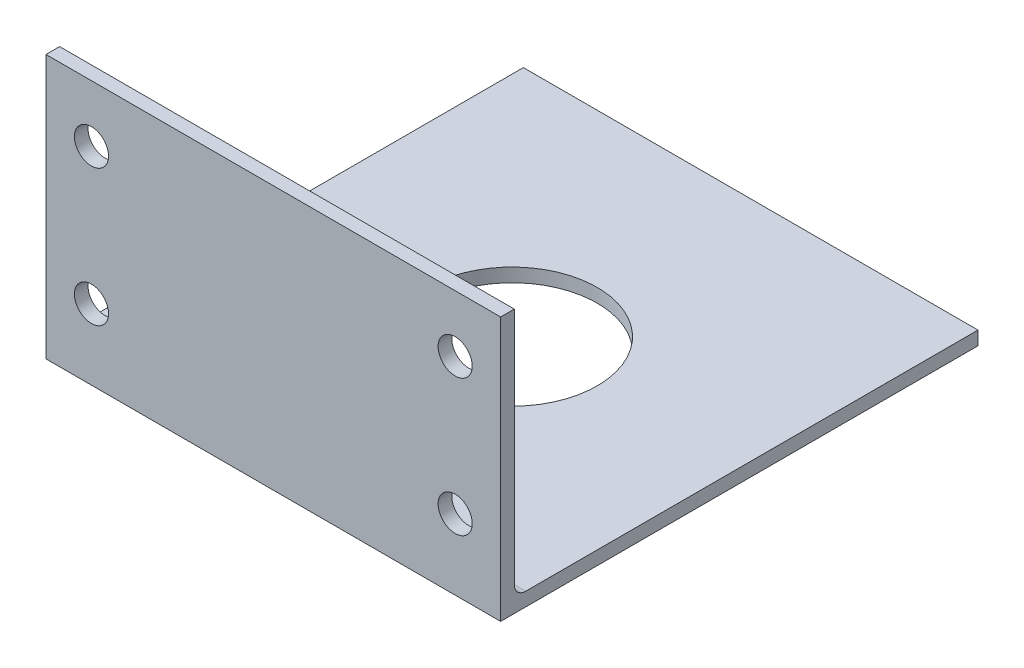
ISO-10303-21;
HEADER;
FILE_DESCRIPTION(('STEP AP214'),'2;1');
FILE_NAME('part.step','',(''),(''),'','','');
FILE_SCHEMA(('AUTOMOTIVE_DESIGN { 1 0 10303 214 1 1 1 1 }'));
ENDSEC;
DATA;
#1=APPLICATION_CONTEXT('core data for automotive mechanical design processes');
#2=APPLICATION_PROTOCOL_DEFINITION('international standard','automotive_design',2000,#1);
#3=PRODUCT_CONTEXT('',#1,'mechanical');
#4=PRODUCT('Part','Part','',(#3));
#5=PRODUCT_RELATED_PRODUCT_CATEGORY('part','',(#4));
#6=PRODUCT_DEFINITION_FORMATION('','',#4);
#7=PRODUCT_DEFINITION_CONTEXT('part definition',#1,'design');
#8=PRODUCT_DEFINITION('design','',#6,#7);
#9=PRODUCT_DEFINITION_SHAPE('','',#8);
#10=(LENGTH_UNIT() NAMED_UNIT(*) SI_UNIT(.MILLI.,.METRE.));
#11=(NAMED_UNIT(*) PLANE_ANGLE_UNIT() SI_UNIT($,.RADIAN.));
#12=(NAMED_UNIT(*) SI_UNIT($,.STERADIAN.) SOLID_ANGLE_UNIT());
#13=UNCERTAINTY_MEASURE_WITH_UNIT(LENGTH_MEASURE(1.E-05),#10,'distance_accuracy_value','');
#14=(GEOMETRIC_REPRESENTATION_CONTEXT(3) GLOBAL_UNCERTAINTY_ASSIGNED_CONTEXT((#13)) GLOBAL_UNIT_ASSIGNED_CONTEXT((#10,
#11,#12)) REPRESENTATION_CONTEXT('',''));
#15=CARTESIAN_POINT('',(0.,0.,0.));
#16=DIRECTION('',(0.,0.,1.));
#17=DIRECTION('',(1.,0.,0.));
#18=AXIS2_PLACEMENT_3D('',#15,#16,#17);
#19=CARTESIAN_POINT('',(0.,0.6,0.));
#20=DIRECTION('',(0.,-1.,0.));
#21=DIRECTION('',(0.,0.,-1.));
#22=AXIS2_PLACEMENT_3D('',#19,#20,#21);
#23=PLANE('',#22);
#24=CARTESIAN_POINT('',(20.,0.6,-21.));
#25=DIRECTION('',(0.,1.,0.));
#26=DIRECTION('',(0.,0.,1.));
#27=AXIS2_PLACEMENT_3D('',#24,#25,#26);
#28=CIRCLE('',#27,7.5);
#29=CARTESIAN_POINT('',(20.,0.6,-13.5));
#30=VERTEX_POINT('',#29);
#31=EDGE_CURVE('E129',#30,#30,#28,.T.);
#32=ORIENTED_EDGE('',*,*,#31,.F.);
#33=EDGE_LOOP('',(#32));
#34=FACE_BOUND('',#33,.T.);
#35=DIRECTION('',(0.,0.,1.));
#36=VECTOR('',#35,1.);
#37=CARTESIAN_POINT('',(0.,0.6,0.));
#38=LINE('',#37,#36);
#39=CARTESIAN_POINT('',(0.,0.6,-42.));
#40=VERTEX_POINT('',#39);
#41=CARTESIAN_POINT('',(0.,0.6,-2.2));
#42=VERTEX_POINT('',#41);
#43=EDGE_CURVE('E135',#40,#42,#38,.T.);
#44=ORIENTED_EDGE('',*,*,#43,.T.);
#45=DIRECTION('',(-1.,0.,0.));
#46=VECTOR('',#45,1.);
#47=CARTESIAN_POINT('',(40.,0.6,-2.2));
#48=LINE('',#47,#46);
#49=CARTESIAN_POINT('',(40.,0.6,-2.2));
#50=VERTEX_POINT('',#49);
#51=EDGE_CURVE('E54',#42,#50,#48,.F.);
#52=ORIENTED_EDGE('',*,*,#51,.T.);
#53=DIRECTION('',(0.,0.,-1.));
#54=VECTOR('',#53,1.);
#55=CARTESIAN_POINT('',(40.,0.6,0.));
#56=LINE('',#55,#54);
#57=CARTESIAN_POINT('',(40.,0.6,-42.));
#58=VERTEX_POINT('',#57);
#59=EDGE_CURVE('E137',#50,#58,#56,.T.);
#60=ORIENTED_EDGE('',*,*,#59,.T.);
#61=DIRECTION('',(-1.,0.,0.));
#62=VECTOR('',#61,1.);
#63=CARTESIAN_POINT('',(0.,0.6,-42.));
#64=LINE('',#63,#62);
#65=EDGE_CURVE('E140',#58,#40,#64,.T.);
#66=ORIENTED_EDGE('',*,*,#65,.T.);
#67=EDGE_LOOP('',(#44,#52,#60,#66));
#68=FACE_BOUND('',#67,.T.);
#69=ADVANCED_FACE('F33',(#34,#68),#23,.F.);
#70=CARTESIAN_POINT('',(0.,0.6,0.));
#71=DIRECTION('',(1.,0.,0.));
#72=DIRECTION('',(0.,0.,-1.));
#73=AXIS2_PLACEMENT_3D('',#70,#71,#72);
#74=PLANE('',#73);
#75=DIRECTION('',(0.,0.,1.));
#76=VECTOR('',#75,1.);
#77=CARTESIAN_POINT('',(0.,-0.6,0.));
#78=LINE('',#77,#76);
#79=CARTESIAN_POINT('',(0.,-0.6,-42.));
#80=VERTEX_POINT('',#79);
#81=CARTESIAN_POINT('',(0.,-0.6,0.));
#82=VERTEX_POINT('',#81);
#83=EDGE_CURVE('E98',#80,#82,#78,.T.);
#84=ORIENTED_EDGE('',*,*,#83,.T.);
#85=DIRECTION('',(0.,-1.,0.));
#86=VECTOR('',#85,1.);
#87=CARTESIAN_POINT('',(0.,0.6,0.));
#88=LINE('',#87,#86);
#89=CARTESIAN_POINT('',(0.,22.6,0.));
#90=VERTEX_POINT('',#89);
#91=EDGE_CURVE('E91',#90,#82,#88,.T.);
#92=ORIENTED_EDGE('',*,*,#91,.F.);
#93=DIRECTION('',(0.,0.,1.));
#94=VECTOR('',#93,1.);
#95=CARTESIAN_POINT('',(0.,22.6,0.));
#96=LINE('',#95,#94);
#97=CARTESIAN_POINT('',(0.,22.6,-1.2));
#98=VERTEX_POINT('',#97);
#99=EDGE_CURVE('E95',#98,#90,#96,.T.);
#100=ORIENTED_EDGE('',*,*,#99,.F.);
#101=DIRECTION('',(0.,-1.,0.));
#102=VECTOR('',#101,1.);
#103=CARTESIAN_POINT('',(0.,22.6,-1.2));
#104=LINE('',#103,#102);
#105=CARTESIAN_POINT('',(0.,1.6,-1.2));
#106=VERTEX_POINT('',#105);
#107=EDGE_CURVE('E124',#98,#106,#104,.T.);
#108=ORIENTED_EDGE('',*,*,#107,.T.);
#109=CARTESIAN_POINT('',(0.,1.6,-2.2));
#110=DIRECTION('',(1.,0.,0.));
#111=DIRECTION('',(0.,0.,-1.));
#112=AXIS2_PLACEMENT_3D('',#109,#110,#111);
#113=CIRCLE('',#112,1.);
#114=EDGE_CURVE('E41',#106,#42,#113,.T.);
#115=ORIENTED_EDGE('',*,*,#114,.T.);
#116=ORIENTED_EDGE('',*,*,#43,.F.);
#117=DIRECTION('',(0.,-1.,0.));
#118=VECTOR('',#117,1.);
#119=CARTESIAN_POINT('',(0.,0.6,-42.));
#120=LINE('',#119,#118);
#121=EDGE_CURVE('E142',#40,#80,#120,.T.);
#122=ORIENTED_EDGE('',*,*,#121,.T.);
#123=EDGE_LOOP('',(#84,#92,#100,#108,#115,#116,#122));
#124=FACE_BOUND('',#123,.T.);
#125=ADVANCED_FACE('F93',(#124),#74,.F.);
#126=CARTESIAN_POINT('',(0.,0.6,0.));
#127=DIRECTION('',(0.,0.,-1.));
#128=DIRECTION('',(-1.,0.,0.));
#129=AXIS2_PLACEMENT_3D('',#126,#127,#128);
#130=PLANE('',#129);
#131=CARTESIAN_POINT('',(36.,5.6,0.));
#132=DIRECTION('',(0.,0.,-1.));
#133=DIRECTION('',(-1.,0.,0.));
#134=AXIS2_PLACEMENT_3D('',#131,#132,#133);
#135=CIRCLE('',#134,1.5);
#136=CARTESIAN_POINT('',(34.5,5.6,0.));
#137=VERTEX_POINT('',#136);
#138=EDGE_CURVE('E226',#137,#137,#135,.T.);
#139=ORIENTED_EDGE('',*,*,#138,.T.);
#140=EDGE_LOOP('',(#139));
#141=FACE_BOUND('',#140,.T.);
#142=CARTESIAN_POINT('',(4.,17.6,0.));
#143=DIRECTION('',(0.,0.,-1.));
#144=DIRECTION('',(-1.,0.,0.));
#145=AXIS2_PLACEMENT_3D('',#142,#143,#144);
#146=CIRCLE('',#145,1.5);
#147=CARTESIAN_POINT('',(2.5,17.6,0.));
#148=VERTEX_POINT('',#147);
#149=EDGE_CURVE('E232',#148,#148,#146,.T.);
#150=ORIENTED_EDGE('',*,*,#149,.T.);
#151=EDGE_LOOP('',(#150));
#152=FACE_BOUND('',#151,.T.);
#153=CARTESIAN_POINT('',(4.,5.6,0.));
#154=DIRECTION('',(0.,0.,-1.));
#155=DIRECTION('',(-1.,0.,0.));
#156=AXIS2_PLACEMENT_3D('',#153,#154,#155);
#157=CIRCLE('',#156,1.5);
#158=CARTESIAN_POINT('',(2.5,5.6,0.));
#159=VERTEX_POINT('',#158);
#160=EDGE_CURVE('E217',#159,#159,#157,.T.);
#161=ORIENTED_EDGE('',*,*,#160,.T.);
#162=EDGE_LOOP('',(#161));
#163=FACE_BOUND('',#162,.T.);
#164=CARTESIAN_POINT('',(36.,17.6,0.));
#165=DIRECTION('',(0.,0.,-1.));
#166=DIRECTION('',(-1.,0.,0.));
#167=AXIS2_PLACEMENT_3D('',#164,#165,#166);
#168=CIRCLE('',#167,1.5);
#169=CARTESIAN_POINT('',(34.5,17.6,0.));
#170=VERTEX_POINT('',#169);
#171=EDGE_CURVE('E115',#170,#170,#168,.T.);
#172=ORIENTED_EDGE('',*,*,#171,.T.);
#173=EDGE_LOOP('',(#172));
#174=FACE_BOUND('',#173,.T.);
#175=DIRECTION('',(1.,0.,0.));
#176=VECTOR('',#175,1.);
#177=CARTESIAN_POINT('',(0.,-0.6,0.));
#178=LINE('',#177,#176);
#179=CARTESIAN_POINT('',(40.,-0.6,0.));
#180=VERTEX_POINT('',#179);
#181=EDGE_CURVE('E144',#82,#180,#178,.T.);
#182=ORIENTED_EDGE('',*,*,#181,.T.);
#183=DIRECTION('',(0.,-1.,0.));
#184=VECTOR('',#183,1.);
#185=CARTESIAN_POINT('',(40.,0.6,0.));
#186=LINE('',#185,#184);
#187=CARTESIAN_POINT('',(40.,22.6,0.));
#188=VERTEX_POINT('',#187);
#189=EDGE_CURVE('E101',#188,#180,#186,.T.);
#190=ORIENTED_EDGE('',*,*,#189,.F.);
#191=DIRECTION('',(1.,0.,0.));
#192=VECTOR('',#191,1.);
#193=CARTESIAN_POINT('',(0.,22.6,0.));
#194=LINE('',#193,#192);
#195=EDGE_CURVE('E104',#90,#188,#194,.T.);
#196=ORIENTED_EDGE('',*,*,#195,.F.);
#197=ORIENTED_EDGE('',*,*,#91,.T.);
#198=EDGE_LOOP('',(#182,#190,#196,#197));
#199=FACE_BOUND('',#198,.T.);
#200=ADVANCED_FACE('F105',(#141,#152,#163,#174,#199),#130,.F.);
#201=CARTESIAN_POINT('',(40.,0.6,0.));
#202=DIRECTION('',(-1.,0.,0.));
#203=DIRECTION('',(0.,0.,1.));
#204=AXIS2_PLACEMENT_3D('',#201,#202,#203);
#205=PLANE('',#204);
#206=DIRECTION('',(0.,0.,-1.));
#207=VECTOR('',#206,1.);
#208=CARTESIAN_POINT('',(40.,-0.6,0.));
#209=LINE('',#208,#207);
#210=CARTESIAN_POINT('',(40.,-0.6,-42.));
#211=VERTEX_POINT('',#210);
#212=EDGE_CURVE('E146',#180,#211,#209,.T.);
#213=ORIENTED_EDGE('',*,*,#212,.T.);
#214=DIRECTION('',(0.,-1.,0.));
#215=VECTOR('',#214,1.);
#216=CARTESIAN_POINT('',(40.,0.6,-42.));
#217=LINE('',#216,#215);
#218=EDGE_CURVE('E150',#58,#211,#217,.T.);
#219=ORIENTED_EDGE('',*,*,#218,.F.);
#220=ORIENTED_EDGE('',*,*,#59,.F.);
#221=CARTESIAN_POINT('',(40.,1.6,-2.2));
#222=DIRECTION('',(-1.,0.,0.));
#223=DIRECTION('',(0.,0.,1.));
#224=AXIS2_PLACEMENT_3D('',#221,#222,#223);
#225=CIRCLE('',#224,1.);
#226=CARTESIAN_POINT('',(40.,1.6,-1.2));
#227=VERTEX_POINT('',#226);
#228=EDGE_CURVE('E11',#50,#227,#225,.T.);
#229=ORIENTED_EDGE('',*,*,#228,.T.);
#230=DIRECTION('',(0.,-1.,0.));
#231=VECTOR('',#230,1.);
#232=CARTESIAN_POINT('',(40.,22.6,-1.2));
#233=LINE('',#232,#231);
#234=CARTESIAN_POINT('',(40.,22.6,-1.2));
#235=VERTEX_POINT('',#234);
#236=EDGE_CURVE('E126',#235,#227,#233,.T.);
#237=ORIENTED_EDGE('',*,*,#236,.F.);
#238=DIRECTION('',(0.,0.,-1.));
#239=VECTOR('',#238,1.);
#240=CARTESIAN_POINT('',(40.,22.6,0.));
#241=LINE('',#240,#239);
#242=EDGE_CURVE('E109',#188,#235,#241,.T.);
#243=ORIENTED_EDGE('',*,*,#242,.F.);
#244=ORIENTED_EDGE('',*,*,#189,.T.);
#245=EDGE_LOOP('',(#213,#219,#220,#229,#237,#243,#244));
#246=FACE_BOUND('',#245,.T.);
#247=ADVANCED_FACE('F163',(#246),#205,.F.);
#248=CARTESIAN_POINT('',(0.,0.6,-42.));
#249=DIRECTION('',(0.,0.,1.));
#250=DIRECTION('',(1.,0.,0.));
#251=AXIS2_PLACEMENT_3D('',#248,#249,#250);
#252=PLANE('',#251);
#253=DIRECTION('',(-1.,0.,0.));
#254=VECTOR('',#253,1.);
#255=CARTESIAN_POINT('',(0.,-0.6,-42.));
#256=LINE('',#255,#254);
#257=EDGE_CURVE('E138',#211,#80,#256,.T.);
#258=ORIENTED_EDGE('',*,*,#257,.T.);
#259=ORIENTED_EDGE('',*,*,#121,.F.);
#260=ORIENTED_EDGE('',*,*,#65,.F.);
#261=ORIENTED_EDGE('',*,*,#218,.T.);
#262=EDGE_LOOP('',(#258,#259,#260,#261));
#263=FACE_BOUND('',#262,.T.);
#264=ADVANCED_FACE('F168',(#263),#252,.F.);
#265=CARTESIAN_POINT('',(0.,-0.6,0.));
#266=DIRECTION('',(0.,-1.,0.));
#267=DIRECTION('',(0.,0.,-1.));
#268=AXIS2_PLACEMENT_3D('',#265,#266,#267);
#269=PLANE('',#268);
#270=CARTESIAN_POINT('',(20.,-0.6,-21.));
#271=DIRECTION('',(0.,1.,0.));
#272=DIRECTION('',(0.,0.,1.));
#273=AXIS2_PLACEMENT_3D('',#270,#271,#272);
#274=CIRCLE('',#273,7.5);
#275=CARTESIAN_POINT('',(20.,-0.6,-13.5));
#276=VERTEX_POINT('',#275);
#277=EDGE_CURVE('E130',#276,#276,#274,.T.);
#278=ORIENTED_EDGE('',*,*,#277,.T.);
#279=EDGE_LOOP('',(#278));
#280=FACE_BOUND('',#279,.T.);
#281=ORIENTED_EDGE('',*,*,#83,.F.);
#282=ORIENTED_EDGE('',*,*,#257,.F.);
#283=ORIENTED_EDGE('',*,*,#212,.F.);
#284=ORIENTED_EDGE('',*,*,#181,.F.);
#285=EDGE_LOOP('',(#281,#282,#283,#284));
#286=FACE_BOUND('',#285,.T.);
#287=ADVANCED_FACE('F171',(#280,#286),#269,.T.);
#288=CARTESIAN_POINT('',(20.,-0.6,-21.));
#289=DIRECTION('',(0.,1.,0.));
#290=DIRECTION('',(0.,0.,1.));
#291=AXIS2_PLACEMENT_3D('',#288,#289,#290);
#292=CYLINDRICAL_SURFACE('',#291,7.5);
#293=ORIENTED_EDGE('',*,*,#277,.F.);
#294=EDGE_LOOP('',(#293));
#295=FACE_BOUND('',#294,.T.);
#296=ORIENTED_EDGE('',*,*,#31,.T.);
#297=EDGE_LOOP('',(#296));
#298=FACE_BOUND('',#297,.T.);
#299=ADVANCED_FACE('F174',(#295,#298),#292,.F.);
#300=CARTESIAN_POINT('',(0.,22.6,-1.2));
#301=DIRECTION('',(0.,0.,1.));
#302=DIRECTION('',(1.,0.,0.));
#303=AXIS2_PLACEMENT_3D('',#300,#301,#302);
#304=PLANE('',#303);
#305=CARTESIAN_POINT('',(36.,5.6,-1.2));
#306=DIRECTION('',(0.,0.,-1.));
#307=DIRECTION('',(-1.,0.,0.));
#308=AXIS2_PLACEMENT_3D('',#305,#306,#307);
#309=CIRCLE('',#308,1.5);
#310=CARTESIAN_POINT('',(34.5,5.6,-1.2));
#311=VERTEX_POINT('',#310);
#312=EDGE_CURVE('E229',#311,#311,#309,.T.);
#313=ORIENTED_EDGE('',*,*,#312,.F.);
#314=EDGE_LOOP('',(#313));
#315=FACE_BOUND('',#314,.T.);
#316=CARTESIAN_POINT('',(4.,17.6,-1.2));
#317=DIRECTION('',(0.,0.,-1.));
#318=DIRECTION('',(-1.,0.,0.));
#319=AXIS2_PLACEMENT_3D('',#316,#317,#318);
#320=CIRCLE('',#319,1.5);
#321=CARTESIAN_POINT('',(2.5,17.6,-1.2));
#322=VERTEX_POINT('',#321);
#323=EDGE_CURVE('E223',#322,#322,#320,.T.);
#324=ORIENTED_EDGE('',*,*,#323,.F.);
#325=EDGE_LOOP('',(#324));
#326=FACE_BOUND('',#325,.T.);
#327=CARTESIAN_POINT('',(4.,5.6,-1.2));
#328=DIRECTION('',(0.,0.,-1.));
#329=DIRECTION('',(-1.,0.,0.));
#330=AXIS2_PLACEMENT_3D('',#327,#328,#329);
#331=CIRCLE('',#330,1.5);
#332=CARTESIAN_POINT('',(2.5,5.6,-1.2));
#333=VERTEX_POINT('',#332);
#334=EDGE_CURVE('E220',#333,#333,#331,.T.);
#335=ORIENTED_EDGE('',*,*,#334,.F.);
#336=EDGE_LOOP('',(#335));
#337=FACE_BOUND('',#336,.T.);
#338=CARTESIAN_POINT('',(36.,17.6,-1.2));
#339=DIRECTION('',(0.,0.,-1.));
#340=DIRECTION('',(-1.,0.,0.));
#341=AXIS2_PLACEMENT_3D('',#338,#339,#340);
#342=CIRCLE('',#341,1.5);
#343=CARTESIAN_POINT('',(34.5,17.6,-1.2));
#344=VERTEX_POINT('',#343);
#345=EDGE_CURVE('E118',#344,#344,#342,.T.);
#346=ORIENTED_EDGE('',*,*,#345,.F.);
#347=EDGE_LOOP('',(#346));
#348=FACE_BOUND('',#347,.T.);
#349=ORIENTED_EDGE('',*,*,#236,.T.);
#350=DIRECTION('',(-1.,0.,0.));
#351=VECTOR('',#350,1.);
#352=CARTESIAN_POINT('',(0.,1.6,-1.2));
#353=LINE('',#352,#351);
#354=EDGE_CURVE('E100',#227,#106,#353,.T.);
#355=ORIENTED_EDGE('',*,*,#354,.T.);
#356=ORIENTED_EDGE('',*,*,#107,.F.);
#357=DIRECTION('',(-1.,0.,0.));
#358=VECTOR('',#357,1.);
#359=CARTESIAN_POINT('',(0.,22.6,-1.2));
#360=LINE('',#359,#358);
#361=EDGE_CURVE('E113',#235,#98,#360,.T.);
#362=ORIENTED_EDGE('',*,*,#361,.F.);
#363=EDGE_LOOP('',(#349,#355,#356,#362));
#364=FACE_BOUND('',#363,.T.);
#365=ADVANCED_FACE('F158',(#315,#326,#337,#348,#364),#304,.F.);
#366=CARTESIAN_POINT('',(0.,22.6,0.));
#367=DIRECTION('',(0.,-1.,0.));
#368=DIRECTION('',(0.,0.,-1.));
#369=AXIS2_PLACEMENT_3D('',#366,#367,#368);
#370=PLANE('',#369);
#371=ORIENTED_EDGE('',*,*,#99,.T.);
#372=ORIENTED_EDGE('',*,*,#195,.T.);
#373=ORIENTED_EDGE('',*,*,#242,.T.);
#374=ORIENTED_EDGE('',*,*,#361,.T.);
#375=EDGE_LOOP('',(#371,#372,#373,#374));
#376=FACE_BOUND('',#375,.T.);
#377=ADVANCED_FACE('F111',(#376),#370,.F.);
#378=CARTESIAN_POINT('',(36.,17.6,0.));
#379=DIRECTION('',(0.,0.,-1.));
#380=DIRECTION('',(-1.,0.,0.));
#381=AXIS2_PLACEMENT_3D('',#378,#379,#380);
#382=CYLINDRICAL_SURFACE('',#381,1.5);
#383=ORIENTED_EDGE('',*,*,#171,.F.);
#384=EDGE_LOOP('',(#383));
#385=FACE_BOUND('',#384,.T.);
#386=ORIENTED_EDGE('',*,*,#345,.T.);
#387=EDGE_LOOP('',(#386));
#388=FACE_BOUND('',#387,.T.);
#389=ADVANCED_FACE('F197',(#385,#388),#382,.F.);
#390=CARTESIAN_POINT('',(4.,5.6,0.));
#391=DIRECTION('',(0.,0.,-1.));
#392=DIRECTION('',(-1.,0.,0.));
#393=AXIS2_PLACEMENT_3D('',#390,#391,#392);
#394=CYLINDRICAL_SURFACE('',#393,1.5);
#395=ORIENTED_EDGE('',*,*,#160,.F.);
#396=EDGE_LOOP('',(#395));
#397=FACE_BOUND('',#396,.T.);
#398=ORIENTED_EDGE('',*,*,#334,.T.);
#399=EDGE_LOOP('',(#398));
#400=FACE_BOUND('',#399,.T.);
#401=ADVANCED_FACE('F200',(#397,#400),#394,.F.);
#402=CARTESIAN_POINT('',(4.,17.6,0.));
#403=DIRECTION('',(0.,0.,-1.));
#404=DIRECTION('',(-1.,0.,0.));
#405=AXIS2_PLACEMENT_3D('',#402,#403,#404);
#406=CYLINDRICAL_SURFACE('',#405,1.5);
#407=ORIENTED_EDGE('',*,*,#149,.F.);
#408=EDGE_LOOP('',(#407));
#409=FACE_BOUND('',#408,.T.);
#410=ORIENTED_EDGE('',*,*,#323,.T.);
#411=EDGE_LOOP('',(#410));
#412=FACE_BOUND('',#411,.T.);
#413=ADVANCED_FACE('F202',(#409,#412),#406,.F.);
#414=CARTESIAN_POINT('',(36.,5.6,0.));
#415=DIRECTION('',(0.,0.,-1.));
#416=DIRECTION('',(-1.,0.,0.));
#417=AXIS2_PLACEMENT_3D('',#414,#415,#416);
#418=CYLINDRICAL_SURFACE('',#417,1.5);
#419=ORIENTED_EDGE('',*,*,#138,.F.);
#420=EDGE_LOOP('',(#419));
#421=FACE_BOUND('',#420,.T.);
#422=ORIENTED_EDGE('',*,*,#312,.T.);
#423=EDGE_LOOP('',(#422));
#424=FACE_BOUND('',#423,.T.);
#425=ADVANCED_FACE('F205',(#421,#424),#418,.F.);
#426=CARTESIAN_POINT('',(0.,1.6,-2.2));
#427=DIRECTION('',(1.,0.,0.));
#428=DIRECTION('',(0.,0.,-1.));
#429=AXIS2_PLACEMENT_3D('',#426,#427,#428);
#430=CYLINDRICAL_SURFACE('',#429,1.);
#431=ORIENTED_EDGE('',*,*,#228,.F.);
#432=ORIENTED_EDGE('',*,*,#51,.F.);
#433=ORIENTED_EDGE('',*,*,#114,.F.);
#434=ORIENTED_EDGE('',*,*,#354,.F.);
#435=EDGE_LOOP('',(#431,#432,#433,#434));
#436=FACE_BOUND('',#435,.T.);
#437=ADVANCED_FACE('F35',(#436),#430,.F.);
#438=CLOSED_SHELL('',(#69,#125,#200,#247,#264,#287,#299,#365,#377,#389,#401,#413,#425,#437));
#439=MANIFOLD_SOLID_BREP('B2',#438);
#440=ADVANCED_BREP_SHAPE_REPRESENTATION('',(#18,#439),#14);
#441=SHAPE_DEFINITION_REPRESENTATION(#9,#440);
ENDSEC;
END-ISO-10303-21;
